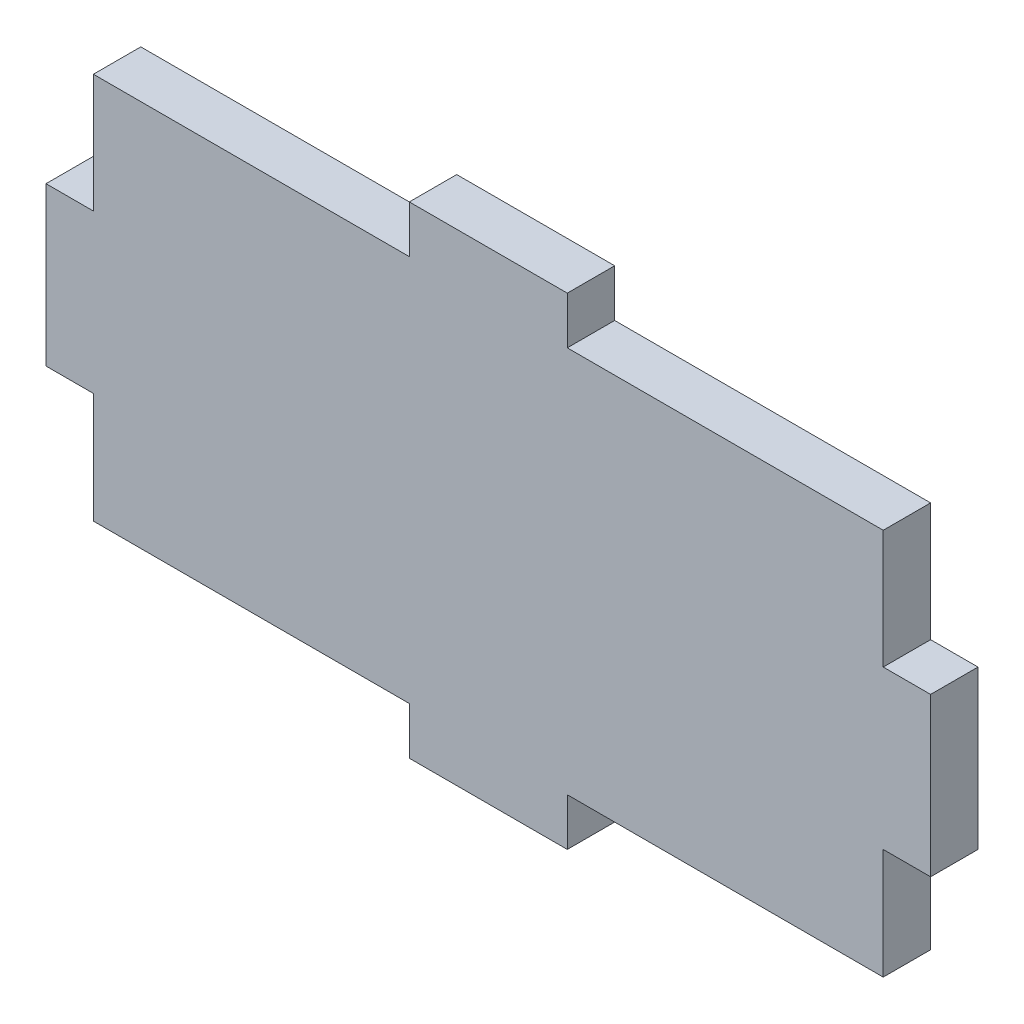
ISO-10303-21;
HEADER;
FILE_DESCRIPTION(('STEP AP214'),'2;1');
FILE_NAME('part.step','',(''),(''),'','','');
FILE_SCHEMA(('AUTOMOTIVE_DESIGN { 1 0 10303 214 1 1 1 1 }'));
ENDSEC;
DATA;
#1=APPLICATION_CONTEXT('core data for automotive mechanical design processes');
#2=APPLICATION_PROTOCOL_DEFINITION('international standard','automotive_design',2000,#1);
#3=PRODUCT_CONTEXT('',#1,'mechanical');
#4=PRODUCT('Part','Part','',(#3));
#5=PRODUCT_RELATED_PRODUCT_CATEGORY('part','',(#4));
#6=PRODUCT_DEFINITION_FORMATION('','',#4);
#7=PRODUCT_DEFINITION_CONTEXT('part definition',#1,'design');
#8=PRODUCT_DEFINITION('design','',#6,#7);
#9=PRODUCT_DEFINITION_SHAPE('','',#8);
#10=(LENGTH_UNIT() NAMED_UNIT(*) SI_UNIT(.MILLI.,.METRE.));
#11=(NAMED_UNIT(*) PLANE_ANGLE_UNIT() SI_UNIT($,.RADIAN.));
#12=(NAMED_UNIT(*) SI_UNIT($,.STERADIAN.) SOLID_ANGLE_UNIT());
#13=UNCERTAINTY_MEASURE_WITH_UNIT(LENGTH_MEASURE(1.E-05),#10,'distance_accuracy_value','');
#14=(GEOMETRIC_REPRESENTATION_CONTEXT(3) GLOBAL_UNCERTAINTY_ASSIGNED_CONTEXT((#13)) GLOBAL_UNIT_ASSIGNED_CONTEXT((#10,
#11,#12)) REPRESENTATION_CONTEXT('',''));
#15=CARTESIAN_POINT('',(0.,0.,0.));
#16=DIRECTION('',(0.,0.,1.));
#17=DIRECTION('',(1.,0.,0.));
#18=AXIS2_PLACEMENT_3D('',#15,#16,#17);
#19=CARTESIAN_POINT('',(3.47631815242721,8.33761556371931,3.));
#20=DIRECTION('',(0.,1.,0.));
#21=DIRECTION('',(-1.,0.,0.));
#22=AXIS2_PLACEMENT_3D('',#19,#20,#21);
#23=PLANE('',#22);
#24=DIRECTION('',(1.,0.,0.));
#25=VECTOR('',#24,1.);
#26=CARTESIAN_POINT('',(3.47631815242721,8.33761556371931,0.));
#27=LINE('',#26,#25);
#28=CARTESIAN_POINT('',(3.47631815242721,8.33761556371931,0.));
#29=VERTEX_POINT('',#28);
#30=CARTESIAN_POINT('',(23.4763181524272,8.33761556371931,0.));
#31=VERTEX_POINT('',#30);
#32=EDGE_CURVE('E205',#29,#31,#27,.T.);
#33=ORIENTED_EDGE('',*,*,#32,.T.);
#34=DIRECTION('',(0.,0.,-1.));
#35=VECTOR('',#34,1.);
#36=CARTESIAN_POINT('',(23.4763181524272,8.33761556371931,3.));
#37=LINE('',#36,#35);
#38=CARTESIAN_POINT('',(23.4763181524272,8.33761556371931,3.));
#39=VERTEX_POINT('',#38);
#40=EDGE_CURVE('E11',#39,#31,#37,.T.);
#41=ORIENTED_EDGE('',*,*,#40,.F.);
#42=DIRECTION('',(1.,0.,0.));
#43=VECTOR('',#42,1.);
#44=CARTESIAN_POINT('',(3.47631815242721,8.33761556371931,3.));
#45=LINE('',#44,#43);
#46=CARTESIAN_POINT('',(3.47631815242721,8.33761556371931,3.));
#47=VERTEX_POINT('',#46);
#48=EDGE_CURVE('E243',#47,#39,#45,.T.);
#49=ORIENTED_EDGE('',*,*,#48,.F.);
#50=DIRECTION('',(0.,0.,-1.));
#51=VECTOR('',#50,1.);
#52=CARTESIAN_POINT('',(3.47631815242721,8.33761556371931,3.));
#53=LINE('',#52,#51);
#54=EDGE_CURVE('E201',#47,#29,#53,.T.);
#55=ORIENTED_EDGE('',*,*,#54,.T.);
#56=EDGE_LOOP('',(#33,#41,#49,#55));
#57=FACE_BOUND('',#56,.T.);
#58=ADVANCED_FACE('F37',(#57),#23,.F.);
#59=CARTESIAN_POINT('',(23.4763181524272,8.33761556371931,3.));
#60=DIRECTION('',(-1.,0.,0.));
#61=DIRECTION('',(0.,-1.,0.));
#62=AXIS2_PLACEMENT_3D('',#59,#60,#61);
#63=PLANE('',#62);
#64=DIRECTION('',(0.,1.,0.));
#65=VECTOR('',#64,1.);
#66=CARTESIAN_POINT('',(23.4763181524272,8.33761556371931,0.));
#67=LINE('',#66,#65);
#68=CARTESIAN_POINT('',(23.4763181524272,15.3376155637193,0.));
#69=VERTEX_POINT('',#68);
#70=EDGE_CURVE('E208',#31,#69,#67,.T.);
#71=ORIENTED_EDGE('',*,*,#70,.T.);
#72=DIRECTION('',(0.,0.,-1.));
#73=VECTOR('',#72,1.);
#74=CARTESIAN_POINT('',(23.4763181524272,15.3376155637193,3.));
#75=LINE('',#74,#73);
#76=CARTESIAN_POINT('',(23.4763181524272,15.3376155637193,3.));
#77=VERTEX_POINT('',#76);
#78=EDGE_CURVE('E45',#77,#69,#75,.T.);
#79=ORIENTED_EDGE('',*,*,#78,.F.);
#80=DIRECTION('',(0.,1.,0.));
#81=VECTOR('',#80,1.);
#82=CARTESIAN_POINT('',(23.4763181524272,8.33761556371931,3.));
#83=LINE('',#82,#81);
#84=EDGE_CURVE('E132',#39,#77,#83,.T.);
#85=ORIENTED_EDGE('',*,*,#84,.F.);
#86=ORIENTED_EDGE('',*,*,#40,.T.);
#87=EDGE_LOOP('',(#71,#79,#85,#86));
#88=FACE_BOUND('',#87,.T.);
#89=ADVANCED_FACE('F361',(#88),#63,.F.);
#90=CARTESIAN_POINT('',(23.4763181524272,15.3376155637193,3.));
#91=DIRECTION('',(0.,1.,0.));
#92=DIRECTION('',(-1.,0.,0.));
#93=AXIS2_PLACEMENT_3D('',#90,#91,#92);
#94=PLANE('',#93);
#95=DIRECTION('',(1.,0.,0.));
#96=VECTOR('',#95,1.);
#97=CARTESIAN_POINT('',(23.4763181524272,15.3376155637193,0.));
#98=LINE('',#97,#96);
#99=CARTESIAN_POINT('',(26.4763181524272,15.3376155637193,0.));
#100=VERTEX_POINT('',#99);
#101=EDGE_CURVE('E210',#69,#100,#98,.T.);
#102=ORIENTED_EDGE('',*,*,#101,.T.);
#103=DIRECTION('',(0.,0.,-1.));
#104=VECTOR('',#103,1.);
#105=CARTESIAN_POINT('',(26.4763181524272,15.3376155637193,3.));
#106=LINE('',#105,#104);
#107=CARTESIAN_POINT('',(26.4763181524272,15.3376155637193,3.));
#108=VERTEX_POINT('',#107);
#109=EDGE_CURVE('E286',#108,#100,#106,.T.);
#110=ORIENTED_EDGE('',*,*,#109,.F.);
#111=DIRECTION('',(1.,0.,0.));
#112=VECTOR('',#111,1.);
#113=CARTESIAN_POINT('',(23.4763181524272,15.3376155637193,3.));
#114=LINE('',#113,#112);
#115=EDGE_CURVE('E294',#77,#108,#114,.T.);
#116=ORIENTED_EDGE('',*,*,#115,.F.);
#117=ORIENTED_EDGE('',*,*,#78,.T.);
#118=EDGE_LOOP('',(#102,#110,#116,#117));
#119=FACE_BOUND('',#118,.T.);
#120=ADVANCED_FACE('F292',(#119),#94,.F.);
#121=CARTESIAN_POINT('',(26.4763181524272,15.3376155637193,3.));
#122=DIRECTION('',(-1.,0.,0.));
#123=DIRECTION('',(0.,0.,1.));
#124=AXIS2_PLACEMENT_3D('',#121,#122,#123);
#125=PLANE('',#124);
#126=DIRECTION('',(0.,1.,0.));
#127=VECTOR('',#126,1.);
#128=CARTESIAN_POINT('',(26.4763181524272,15.3376155637193,0.));
#129=LINE('',#128,#127);
#130=CARTESIAN_POINT('',(26.4763181524272,25.3376155637193,0.));
#131=VERTEX_POINT('',#130);
#132=EDGE_CURVE('E212',#100,#131,#129,.T.);
#133=ORIENTED_EDGE('',*,*,#132,.T.);
#134=DIRECTION('',(0.,0.,-1.));
#135=VECTOR('',#134,1.);
#136=CARTESIAN_POINT('',(26.4763181524272,25.3376155637193,3.));
#137=LINE('',#136,#135);
#138=CARTESIAN_POINT('',(26.4763181524272,25.3376155637193,3.));
#139=VERTEX_POINT('',#138);
#140=EDGE_CURVE('E283',#139,#131,#137,.T.);
#141=ORIENTED_EDGE('',*,*,#140,.F.);
#142=DIRECTION('',(0.,1.,0.));
#143=VECTOR('',#142,1.);
#144=CARTESIAN_POINT('',(26.4763181524272,15.3376155637193,3.));
#145=LINE('',#144,#143);
#146=EDGE_CURVE('E312',#108,#139,#145,.T.);
#147=ORIENTED_EDGE('',*,*,#146,.F.);
#148=ORIENTED_EDGE('',*,*,#109,.T.);
#149=EDGE_LOOP('',(#133,#141,#147,#148));
#150=FACE_BOUND('',#149,.T.);
#151=ADVANCED_FACE('F303',(#150),#125,.F.);
#152=CARTESIAN_POINT('',(26.4763181524272,25.3376155637193,3.));
#153=DIRECTION('',(0.,-1.,0.));
#154=DIRECTION('',(0.,0.,-1.));
#155=AXIS2_PLACEMENT_3D('',#152,#153,#154);
#156=PLANE('',#155);
#157=DIRECTION('',(-1.,0.,0.));
#158=VECTOR('',#157,1.);
#159=CARTESIAN_POINT('',(26.4763181524272,25.3376155637193,0.));
#160=LINE('',#159,#158);
#161=CARTESIAN_POINT('',(23.4763181524272,25.3376155637193,0.));
#162=VERTEX_POINT('',#161);
#163=EDGE_CURVE('E214',#131,#162,#160,.T.);
#164=ORIENTED_EDGE('',*,*,#163,.T.);
#165=DIRECTION('',(0.,0.,-1.));
#166=VECTOR('',#165,1.);
#167=CARTESIAN_POINT('',(23.4763181524272,25.3376155637193,3.));
#168=LINE('',#167,#166);
#169=CARTESIAN_POINT('',(23.4763181524272,25.3376155637193,3.));
#170=VERTEX_POINT('',#169);
#171=EDGE_CURVE('E280',#170,#162,#168,.T.);
#172=ORIENTED_EDGE('',*,*,#171,.F.);
#173=DIRECTION('',(-1.,0.,0.));
#174=VECTOR('',#173,1.);
#175=CARTESIAN_POINT('',(26.4763181524272,25.3376155637193,3.));
#176=LINE('',#175,#174);
#177=EDGE_CURVE('E309',#139,#170,#176,.T.);
#178=ORIENTED_EDGE('',*,*,#177,.F.);
#179=ORIENTED_EDGE('',*,*,#140,.T.);
#180=EDGE_LOOP('',(#164,#172,#178,#179));
#181=FACE_BOUND('',#180,.T.);
#182=ADVANCED_FACE('F307',(#181),#156,.F.);
#183=CARTESIAN_POINT('',(23.4763181524272,25.3376155637193,3.));
#184=DIRECTION('',(-1.,0.,0.));
#185=DIRECTION('',(0.,-1.,0.));
#186=AXIS2_PLACEMENT_3D('',#183,#184,#185);
#187=PLANE('',#186);
#188=DIRECTION('',(0.,1.,0.));
#189=VECTOR('',#188,1.);
#190=CARTESIAN_POINT('',(23.4763181524272,25.3376155637193,0.));
#191=LINE('',#190,#189);
#192=CARTESIAN_POINT('',(23.4763181524272,32.8376155637193,0.));
#193=VERTEX_POINT('',#192);
#194=EDGE_CURVE('E216',#162,#193,#191,.T.);
#195=ORIENTED_EDGE('',*,*,#194,.T.);
#196=DIRECTION('',(0.,0.,-1.));
#197=VECTOR('',#196,1.);
#198=CARTESIAN_POINT('',(23.4763181524272,32.8376155637193,3.));
#199=LINE('',#198,#197);
#200=CARTESIAN_POINT('',(23.4763181524272,32.8376155637193,3.));
#201=VERTEX_POINT('',#200);
#202=EDGE_CURVE('E277',#201,#193,#199,.T.);
#203=ORIENTED_EDGE('',*,*,#202,.F.);
#204=DIRECTION('',(0.,1.,0.));
#205=VECTOR('',#204,1.);
#206=CARTESIAN_POINT('',(23.4763181524272,25.3376155637193,3.));
#207=LINE('',#206,#205);
#208=EDGE_CURVE('E311',#170,#201,#207,.T.);
#209=ORIENTED_EDGE('',*,*,#208,.F.);
#210=ORIENTED_EDGE('',*,*,#171,.T.);
#211=EDGE_LOOP('',(#195,#203,#209,#210));
#212=FACE_BOUND('',#211,.T.);
#213=ADVANCED_FACE('F374',(#212),#187,.F.);
#214=CARTESIAN_POINT('',(3.4763181524272,32.8376155637193,3.));
#215=DIRECTION('',(0.,-1.,0.));
#216=DIRECTION('',(1.,0.,0.));
#217=AXIS2_PLACEMENT_3D('',#214,#215,#216);
#218=PLANE('',#217);
#219=DIRECTION('',(-1.,0.,0.));
#220=VECTOR('',#219,1.);
#221=CARTESIAN_POINT('',(3.4763181524272,32.8376155637193,0.));
#222=LINE('',#221,#220);
#223=CARTESIAN_POINT('',(3.4763181524272,32.8376155637193,0.));
#224=VERTEX_POINT('',#223);
#225=EDGE_CURVE('E218',#193,#224,#222,.T.);
#226=ORIENTED_EDGE('',*,*,#225,.T.);
#227=DIRECTION('',(0.,0.,-1.));
#228=VECTOR('',#227,1.);
#229=CARTESIAN_POINT('',(3.4763181524272,32.8376155637193,3.));
#230=LINE('',#229,#228);
#231=CARTESIAN_POINT('',(3.4763181524272,32.8376155637193,3.));
#232=VERTEX_POINT('',#231);
#233=EDGE_CURVE('E274',#232,#224,#230,.T.);
#234=ORIENTED_EDGE('',*,*,#233,.F.);
#235=DIRECTION('',(-1.,0.,0.));
#236=VECTOR('',#235,1.);
#237=CARTESIAN_POINT('',(3.4763181524272,32.8376155637193,3.));
#238=LINE('',#237,#236);
#239=EDGE_CURVE('E314',#201,#232,#238,.T.);
#240=ORIENTED_EDGE('',*,*,#239,.F.);
#241=ORIENTED_EDGE('',*,*,#202,.T.);
#242=EDGE_LOOP('',(#226,#234,#240,#241));
#243=FACE_BOUND('',#242,.T.);
#244=ADVANCED_FACE('F377',(#243),#218,.F.);
#245=CARTESIAN_POINT('',(3.4763181524272,32.8376155637193,3.));
#246=DIRECTION('',(-1.,0.,0.));
#247=DIRECTION('',(0.,-1.,0.));
#248=AXIS2_PLACEMENT_3D('',#245,#246,#247);
#249=PLANE('',#248);
#250=DIRECTION('',(0.,1.,0.));
#251=VECTOR('',#250,1.);
#252=CARTESIAN_POINT('',(3.4763181524272,32.8376155637193,0.));
#253=LINE('',#252,#251);
#254=CARTESIAN_POINT('',(3.47631815242721,35.8376155637193,0.));
#255=VERTEX_POINT('',#254);
#256=EDGE_CURVE('E220',#224,#255,#253,.T.);
#257=ORIENTED_EDGE('',*,*,#256,.T.);
#258=DIRECTION('',(0.,0.,-1.));
#259=VECTOR('',#258,1.);
#260=CARTESIAN_POINT('',(3.47631815242721,35.8376155637193,3.));
#261=LINE('',#260,#259);
#262=CARTESIAN_POINT('',(3.47631815242721,35.8376155637193,3.));
#263=VERTEX_POINT('',#262);
#264=EDGE_CURVE('E271',#263,#255,#261,.T.);
#265=ORIENTED_EDGE('',*,*,#264,.F.);
#266=DIRECTION('',(0.,1.,0.));
#267=VECTOR('',#266,1.);
#268=CARTESIAN_POINT('',(3.4763181524272,32.8376155637193,3.));
#269=LINE('',#268,#267);
#270=EDGE_CURVE('E320',#232,#263,#269,.T.);
#271=ORIENTED_EDGE('',*,*,#270,.F.);
#272=ORIENTED_EDGE('',*,*,#233,.T.);
#273=EDGE_LOOP('',(#257,#265,#271,#272));
#274=FACE_BOUND('',#273,.T.);
#275=ADVANCED_FACE('F381',(#274),#249,.F.);
#276=CARTESIAN_POINT('',(3.47631815242721,35.8376155637193,3.));
#277=DIRECTION('',(0.,-1.,0.));
#278=DIRECTION('',(0.,0.,-1.));
#279=AXIS2_PLACEMENT_3D('',#276,#277,#278);
#280=PLANE('',#279);
#281=DIRECTION('',(-1.,0.,0.));
#282=VECTOR('',#281,1.);
#283=CARTESIAN_POINT('',(3.47631815242721,35.8376155637193,0.));
#284=LINE('',#283,#282);
#285=CARTESIAN_POINT('',(-6.52368184757279,35.8376155637193,0.));
#286=VERTEX_POINT('',#285);
#287=EDGE_CURVE('E222',#255,#286,#284,.T.);
#288=ORIENTED_EDGE('',*,*,#287,.T.);
#289=DIRECTION('',(0.,0.,-1.));
#290=VECTOR('',#289,1.);
#291=CARTESIAN_POINT('',(-6.52368184757279,35.8376155637193,3.));
#292=LINE('',#291,#290);
#293=CARTESIAN_POINT('',(-6.52368184757279,35.8376155637193,3.));
#294=VERTEX_POINT('',#293);
#295=EDGE_CURVE('E268',#294,#286,#292,.T.);
#296=ORIENTED_EDGE('',*,*,#295,.F.);
#297=DIRECTION('',(-1.,0.,0.));
#298=VECTOR('',#297,1.);
#299=CARTESIAN_POINT('',(3.47631815242721,35.8376155637193,3.));
#300=LINE('',#299,#298);
#301=EDGE_CURVE('E322',#263,#294,#300,.T.);
#302=ORIENTED_EDGE('',*,*,#301,.F.);
#303=ORIENTED_EDGE('',*,*,#264,.T.);
#304=EDGE_LOOP('',(#288,#296,#302,#303));
#305=FACE_BOUND('',#304,.T.);
#306=ADVANCED_FACE('F385',(#305),#280,.F.);
#307=CARTESIAN_POINT('',(-6.52368184757279,35.8376155637193,3.));
#308=DIRECTION('',(1.,0.,0.));
#309=DIRECTION('',(0.,1.,0.));
#310=AXIS2_PLACEMENT_3D('',#307,#308,#309);
#311=PLANE('',#310);
#312=DIRECTION('',(0.,-1.,0.));
#313=VECTOR('',#312,1.);
#314=CARTESIAN_POINT('',(-6.52368184757279,35.8376155637193,0.));
#315=LINE('',#314,#313);
#316=CARTESIAN_POINT('',(-6.52368184757279,32.8376155637193,0.));
#317=VERTEX_POINT('',#316);
#318=EDGE_CURVE('E224',#286,#317,#315,.T.);
#319=ORIENTED_EDGE('',*,*,#318,.T.);
#320=DIRECTION('',(0.,0.,-1.));
#321=VECTOR('',#320,1.);
#322=CARTESIAN_POINT('',(-6.52368184757279,32.8376155637193,3.));
#323=LINE('',#322,#321);
#324=CARTESIAN_POINT('',(-6.52368184757279,32.8376155637193,3.));
#325=VERTEX_POINT('',#324);
#326=EDGE_CURVE('E265',#325,#317,#323,.T.);
#327=ORIENTED_EDGE('',*,*,#326,.F.);
#328=DIRECTION('',(0.,-1.,0.));
#329=VECTOR('',#328,1.);
#330=CARTESIAN_POINT('',(-6.52368184757279,35.8376155637193,3.));
#331=LINE('',#330,#329);
#332=EDGE_CURVE('E324',#294,#325,#331,.T.);
#333=ORIENTED_EDGE('',*,*,#332,.F.);
#334=ORIENTED_EDGE('',*,*,#295,.T.);
#335=EDGE_LOOP('',(#319,#327,#333,#334));
#336=FACE_BOUND('',#335,.T.);
#337=ADVANCED_FACE('F389',(#336),#311,.F.);
#338=CARTESIAN_POINT('',(-6.52368184757279,32.8376155637193,3.));
#339=DIRECTION('',(0.,-1.,0.));
#340=DIRECTION('',(1.,0.,0.));
#341=AXIS2_PLACEMENT_3D('',#338,#339,#340);
#342=PLANE('',#341);
#343=DIRECTION('',(-1.,0.,0.));
#344=VECTOR('',#343,1.);
#345=CARTESIAN_POINT('',(-6.52368184757279,32.8376155637193,0.));
#346=LINE('',#345,#344);
#347=CARTESIAN_POINT('',(-26.5236818475728,32.8376155637193,0.));
#348=VERTEX_POINT('',#347);
#349=EDGE_CURVE('E226',#317,#348,#346,.T.);
#350=ORIENTED_EDGE('',*,*,#349,.T.);
#351=DIRECTION('',(0.,0.,-1.));
#352=VECTOR('',#351,1.);
#353=CARTESIAN_POINT('',(-26.5236818475728,32.8376155637193,3.));
#354=LINE('',#353,#352);
#355=CARTESIAN_POINT('',(-26.5236818475728,32.8376155637193,3.));
#356=VERTEX_POINT('',#355);
#357=EDGE_CURVE('E262',#356,#348,#354,.T.);
#358=ORIENTED_EDGE('',*,*,#357,.F.);
#359=DIRECTION('',(-1.,0.,0.));
#360=VECTOR('',#359,1.);
#361=CARTESIAN_POINT('',(-6.52368184757279,32.8376155637193,3.));
#362=LINE('',#361,#360);
#363=EDGE_CURVE('E326',#325,#356,#362,.T.);
#364=ORIENTED_EDGE('',*,*,#363,.F.);
#365=ORIENTED_EDGE('',*,*,#326,.T.);
#366=EDGE_LOOP('',(#350,#358,#364,#365));
#367=FACE_BOUND('',#366,.T.);
#368=ADVANCED_FACE('F393',(#367),#342,.F.);
#369=CARTESIAN_POINT('',(-26.5236818475728,25.3376155637193,3.));
#370=DIRECTION('',(1.,0.,0.));
#371=DIRECTION('',(0.,1.,0.));
#372=AXIS2_PLACEMENT_3D('',#369,#370,#371);
#373=PLANE('',#372);
#374=DIRECTION('',(0.,-1.,0.));
#375=VECTOR('',#374,1.);
#376=CARTESIAN_POINT('',(-26.5236818475728,25.3376155637193,0.));
#377=LINE('',#376,#375);
#378=CARTESIAN_POINT('',(-26.5236818475728,25.3376155637193,0.));
#379=VERTEX_POINT('',#378);
#380=EDGE_CURVE('E228',#348,#379,#377,.T.);
#381=ORIENTED_EDGE('',*,*,#380,.T.);
#382=DIRECTION('',(0.,0.,-1.));
#383=VECTOR('',#382,1.);
#384=CARTESIAN_POINT('',(-26.5236818475728,25.3376155637193,3.));
#385=LINE('',#384,#383);
#386=CARTESIAN_POINT('',(-26.5236818475728,25.3376155637193,3.));
#387=VERTEX_POINT('',#386);
#388=EDGE_CURVE('E259',#387,#379,#385,.T.);
#389=ORIENTED_EDGE('',*,*,#388,.F.);
#390=DIRECTION('',(0.,-1.,0.));
#391=VECTOR('',#390,1.);
#392=CARTESIAN_POINT('',(-26.5236818475728,25.3376155637193,3.));
#393=LINE('',#392,#391);
#394=EDGE_CURVE('E328',#356,#387,#393,.T.);
#395=ORIENTED_EDGE('',*,*,#394,.F.);
#396=ORIENTED_EDGE('',*,*,#357,.T.);
#397=EDGE_LOOP('',(#381,#389,#395,#396));
#398=FACE_BOUND('',#397,.T.);
#399=ADVANCED_FACE('F397',(#398),#373,.F.);
#400=CARTESIAN_POINT('',(-29.5236818475728,25.3376155637193,3.));
#401=DIRECTION('',(0.,-1.,0.));
#402=DIRECTION('',(0.,0.,-1.));
#403=AXIS2_PLACEMENT_3D('',#400,#401,#402);
#404=PLANE('',#403);
#405=DIRECTION('',(-1.,0.,0.));
#406=VECTOR('',#405,1.);
#407=CARTESIAN_POINT('',(-29.5236818475728,25.3376155637193,0.));
#408=LINE('',#407,#406);
#409=CARTESIAN_POINT('',(-29.5236818475728,25.3376155637193,0.));
#410=VERTEX_POINT('',#409);
#411=EDGE_CURVE('E230',#379,#410,#408,.T.);
#412=ORIENTED_EDGE('',*,*,#411,.T.);
#413=DIRECTION('',(0.,0.,-1.));
#414=VECTOR('',#413,1.);
#415=CARTESIAN_POINT('',(-29.5236818475728,25.3376155637193,3.));
#416=LINE('',#415,#414);
#417=CARTESIAN_POINT('',(-29.5236818475728,25.3376155637193,3.));
#418=VERTEX_POINT('',#417);
#419=EDGE_CURVE('E256',#418,#410,#416,.T.);
#420=ORIENTED_EDGE('',*,*,#419,.F.);
#421=DIRECTION('',(-1.,0.,0.));
#422=VECTOR('',#421,1.);
#423=CARTESIAN_POINT('',(-29.5236818475728,25.3376155637193,3.));
#424=LINE('',#423,#422);
#425=EDGE_CURVE('E330',#387,#418,#424,.T.);
#426=ORIENTED_EDGE('',*,*,#425,.F.);
#427=ORIENTED_EDGE('',*,*,#388,.T.);
#428=EDGE_LOOP('',(#412,#420,#426,#427));
#429=FACE_BOUND('',#428,.T.);
#430=ADVANCED_FACE('F401',(#429),#404,.F.);
#431=CARTESIAN_POINT('',(-29.5236818475728,15.3376155637193,3.));
#432=DIRECTION('',(1.,0.,0.));
#433=DIRECTION('',(0.,0.,-1.));
#434=AXIS2_PLACEMENT_3D('',#431,#432,#433);
#435=PLANE('',#434);
#436=DIRECTION('',(0.,-1.,0.));
#437=VECTOR('',#436,1.);
#438=CARTESIAN_POINT('',(-29.5236818475728,15.3376155637193,0.));
#439=LINE('',#438,#437);
#440=CARTESIAN_POINT('',(-29.5236818475728,15.3376155637193,0.));
#441=VERTEX_POINT('',#440);
#442=EDGE_CURVE('E232',#410,#441,#439,.T.);
#443=ORIENTED_EDGE('',*,*,#442,.T.);
#444=DIRECTION('',(0.,0.,-1.));
#445=VECTOR('',#444,1.);
#446=CARTESIAN_POINT('',(-29.5236818475728,15.3376155637193,3.));
#447=LINE('',#446,#445);
#448=CARTESIAN_POINT('',(-29.5236818475728,15.3376155637193,3.));
#449=VERTEX_POINT('',#448);
#450=EDGE_CURVE('E253',#449,#441,#447,.T.);
#451=ORIENTED_EDGE('',*,*,#450,.F.);
#452=DIRECTION('',(0.,-1.,0.));
#453=VECTOR('',#452,1.);
#454=CARTESIAN_POINT('',(-29.5236818475728,15.3376155637193,3.));
#455=LINE('',#454,#453);
#456=EDGE_CURVE('E332',#418,#449,#455,.T.);
#457=ORIENTED_EDGE('',*,*,#456,.F.);
#458=ORIENTED_EDGE('',*,*,#419,.T.);
#459=EDGE_LOOP('',(#443,#451,#457,#458));
#460=FACE_BOUND('',#459,.T.);
#461=ADVANCED_FACE('F405',(#460),#435,.F.);
#462=CARTESIAN_POINT('',(-26.5236818475728,15.3376155637193,3.));
#463=DIRECTION('',(0.,1.,0.));
#464=DIRECTION('',(0.,0.,1.));
#465=AXIS2_PLACEMENT_3D('',#462,#463,#464);
#466=PLANE('',#465);
#467=DIRECTION('',(1.,0.,0.));
#468=VECTOR('',#467,1.);
#469=CARTESIAN_POINT('',(-26.5236818475728,15.3376155637193,0.));
#470=LINE('',#469,#468);
#471=CARTESIAN_POINT('',(-26.5236818475728,15.3376155637193,0.));
#472=VERTEX_POINT('',#471);
#473=EDGE_CURVE('E234',#441,#472,#470,.T.);
#474=ORIENTED_EDGE('',*,*,#473,.T.);
#475=DIRECTION('',(0.,0.,-1.));
#476=VECTOR('',#475,1.);
#477=CARTESIAN_POINT('',(-26.5236818475728,15.3376155637193,3.));
#478=LINE('',#477,#476);
#479=CARTESIAN_POINT('',(-26.5236818475728,15.3376155637193,3.));
#480=VERTEX_POINT('',#479);
#481=EDGE_CURVE('E250',#480,#472,#478,.T.);
#482=ORIENTED_EDGE('',*,*,#481,.F.);
#483=DIRECTION('',(1.,0.,0.));
#484=VECTOR('',#483,1.);
#485=CARTESIAN_POINT('',(-26.5236818475728,15.3376155637193,3.));
#486=LINE('',#485,#484);
#487=EDGE_CURVE('E334',#449,#480,#486,.T.);
#488=ORIENTED_EDGE('',*,*,#487,.F.);
#489=ORIENTED_EDGE('',*,*,#450,.T.);
#490=EDGE_LOOP('',(#474,#482,#488,#489));
#491=FACE_BOUND('',#490,.T.);
#492=ADVANCED_FACE('F409',(#491),#466,.F.);
#493=CARTESIAN_POINT('',(-26.5236818475728,8.3376155637193,3.));
#494=DIRECTION('',(1.,0.,0.));
#495=DIRECTION('',(0.,1.,0.));
#496=AXIS2_PLACEMENT_3D('',#493,#494,#495);
#497=PLANE('',#496);
#498=DIRECTION('',(0.,-1.,0.));
#499=VECTOR('',#498,1.);
#500=CARTESIAN_POINT('',(-26.5236818475728,8.3376155637193,0.));
#501=LINE('',#500,#499);
#502=CARTESIAN_POINT('',(-26.5236818475728,8.3376155637193,0.));
#503=VERTEX_POINT('',#502);
#504=EDGE_CURVE('E236',#472,#503,#501,.T.);
#505=ORIENTED_EDGE('',*,*,#504,.T.);
#506=DIRECTION('',(0.,0.,-1.));
#507=VECTOR('',#506,1.);
#508=CARTESIAN_POINT('',(-26.5236818475728,8.3376155637193,3.));
#509=LINE('',#508,#507);
#510=CARTESIAN_POINT('',(-26.5236818475728,8.3376155637193,3.));
#511=VERTEX_POINT('',#510);
#512=EDGE_CURVE('E247',#511,#503,#509,.T.);
#513=ORIENTED_EDGE('',*,*,#512,.F.);
#514=DIRECTION('',(0.,-1.,0.));
#515=VECTOR('',#514,1.);
#516=CARTESIAN_POINT('',(-26.5236818475728,8.3376155637193,3.));
#517=LINE('',#516,#515);
#518=EDGE_CURVE('E336',#480,#511,#517,.T.);
#519=ORIENTED_EDGE('',*,*,#518,.F.);
#520=ORIENTED_EDGE('',*,*,#481,.T.);
#521=EDGE_LOOP('',(#505,#513,#519,#520));
#522=FACE_BOUND('',#521,.T.);
#523=ADVANCED_FACE('F342',(#522),#497,.F.);
#524=CARTESIAN_POINT('',(-6.52368184757279,8.33761556371931,3.));
#525=DIRECTION('',(0.,1.,0.));
#526=DIRECTION('',(-1.,0.,0.));
#527=AXIS2_PLACEMENT_3D('',#524,#525,#526);
#528=PLANE('',#527);
#529=DIRECTION('',(1.,0.,0.));
#530=VECTOR('',#529,1.);
#531=CARTESIAN_POINT('',(-6.52368184757279,8.33761556371931,0.));
#532=LINE('',#531,#530);
#533=CARTESIAN_POINT('',(-6.52368184757279,8.33761556371931,0.));
#534=VERTEX_POINT('',#533);
#535=EDGE_CURVE('E238',#503,#534,#532,.T.);
#536=ORIENTED_EDGE('',*,*,#535,.T.);
#537=DIRECTION('',(0.,0.,-1.));
#538=VECTOR('',#537,1.);
#539=CARTESIAN_POINT('',(-6.52368184757279,8.33761556371931,3.));
#540=LINE('',#539,#538);
#541=CARTESIAN_POINT('',(-6.52368184757279,8.33761556371931,3.));
#542=VERTEX_POINT('',#541);
#543=EDGE_CURVE('E196',#542,#534,#540,.T.);
#544=ORIENTED_EDGE('',*,*,#543,.F.);
#545=DIRECTION('',(1.,0.,0.));
#546=VECTOR('',#545,1.);
#547=CARTESIAN_POINT('',(-6.52368184757279,8.33761556371931,3.));
#548=LINE('',#547,#546);
#549=EDGE_CURVE('E187',#511,#542,#548,.T.);
#550=ORIENTED_EDGE('',*,*,#549,.F.);
#551=ORIENTED_EDGE('',*,*,#512,.T.);
#552=EDGE_LOOP('',(#536,#544,#550,#551));
#553=FACE_BOUND('',#552,.T.);
#554=ADVANCED_FACE('F346',(#553),#528,.F.);
#555=CARTESIAN_POINT('',(-6.52368184757279,5.33761556371931,3.));
#556=DIRECTION('',(1.,0.,0.));
#557=DIRECTION('',(0.,0.,-1.));
#558=AXIS2_PLACEMENT_3D('',#555,#556,#557);
#559=PLANE('',#558);
#560=DIRECTION('',(0.,-1.,0.));
#561=VECTOR('',#560,1.);
#562=CARTESIAN_POINT('',(-6.52368184757279,5.33761556371931,0.));
#563=LINE('',#562,#561);
#564=CARTESIAN_POINT('',(-6.52368184757279,5.33761556371931,0.));
#565=VERTEX_POINT('',#564);
#566=EDGE_CURVE('E195',#534,#565,#563,.T.);
#567=ORIENTED_EDGE('',*,*,#566,.T.);
#568=DIRECTION('',(0.,0.,-1.));
#569=VECTOR('',#568,1.);
#570=CARTESIAN_POINT('',(-6.52368184757279,5.33761556371931,3.));
#571=LINE('',#570,#569);
#572=CARTESIAN_POINT('',(-6.52368184757279,5.33761556371931,3.));
#573=VERTEX_POINT('',#572);
#574=EDGE_CURVE('E192',#573,#565,#571,.T.);
#575=ORIENTED_EDGE('',*,*,#574,.F.);
#576=DIRECTION('',(0.,-1.,0.));
#577=VECTOR('',#576,1.);
#578=CARTESIAN_POINT('',(-6.52368184757279,5.33761556371931,3.));
#579=LINE('',#578,#577);
#580=EDGE_CURVE('E181',#542,#573,#579,.T.);
#581=ORIENTED_EDGE('',*,*,#580,.F.);
#582=ORIENTED_EDGE('',*,*,#543,.T.);
#583=EDGE_LOOP('',(#567,#575,#581,#582));
#584=FACE_BOUND('',#583,.T.);
#585=ADVANCED_FACE('F193',(#584),#559,.F.);
#586=CARTESIAN_POINT('',(3.47631815242721,5.33761556371931,3.));
#587=DIRECTION('',(0.,1.,0.));
#588=DIRECTION('',(-1.,0.,0.));
#589=AXIS2_PLACEMENT_3D('',#586,#587,#588);
#590=PLANE('',#589);
#591=DIRECTION('',(1.,0.,0.));
#592=VECTOR('',#591,1.);
#593=CARTESIAN_POINT('',(3.47631815242721,5.33761556371931,0.));
#594=LINE('',#593,#592);
#595=CARTESIAN_POINT('',(3.47631815242721,5.33761556371931,0.));
#596=VERTEX_POINT('',#595);
#597=EDGE_CURVE('E118',#565,#596,#594,.T.);
#598=ORIENTED_EDGE('',*,*,#597,.T.);
#599=DIRECTION('',(0.,0.,-1.));
#600=VECTOR('',#599,1.);
#601=CARTESIAN_POINT('',(3.47631815242721,5.33761556371931,3.));
#602=LINE('',#601,#600);
#603=CARTESIAN_POINT('',(3.47631815242721,5.33761556371931,3.));
#604=VERTEX_POINT('',#603);
#605=EDGE_CURVE('E197',#604,#596,#602,.T.);
#606=ORIENTED_EDGE('',*,*,#605,.F.);
#607=DIRECTION('',(1.,0.,0.));
#608=VECTOR('',#607,1.);
#609=CARTESIAN_POINT('',(3.47631815242721,5.33761556371931,3.));
#610=LINE('',#609,#608);
#611=EDGE_CURVE('E185',#573,#604,#610,.T.);
#612=ORIENTED_EDGE('',*,*,#611,.F.);
#613=ORIENTED_EDGE('',*,*,#574,.T.);
#614=EDGE_LOOP('',(#598,#606,#612,#613));
#615=FACE_BOUND('',#614,.T.);
#616=ADVANCED_FACE('F199',(#615),#590,.F.);
#617=CARTESIAN_POINT('',(3.47631815242721,8.33761556371931,3.));
#618=DIRECTION('',(-1.,0.,0.));
#619=DIRECTION('',(0.,0.,1.));
#620=AXIS2_PLACEMENT_3D('',#617,#618,#619);
#621=PLANE('',#620);
#622=DIRECTION('',(0.,1.,0.));
#623=VECTOR('',#622,1.);
#624=CARTESIAN_POINT('',(3.47631815242721,8.33761556371931,0.));
#625=LINE('',#624,#623);
#626=EDGE_CURVE('E124',#596,#29,#625,.T.);
#627=ORIENTED_EDGE('',*,*,#626,.T.);
#628=ORIENTED_EDGE('',*,*,#54,.F.);
#629=DIRECTION('',(0.,1.,0.));
#630=VECTOR('',#629,1.);
#631=CARTESIAN_POINT('',(3.47631815242721,8.33761556371931,3.));
#632=LINE('',#631,#630);
#633=EDGE_CURVE('E53',#604,#47,#632,.T.);
#634=ORIENTED_EDGE('',*,*,#633,.F.);
#635=ORIENTED_EDGE('',*,*,#605,.T.);
#636=EDGE_LOOP('',(#627,#628,#634,#635));
#637=FACE_BOUND('',#636,.T.);
#638=ADVANCED_FACE('F350',(#637),#621,.F.);
#639=CARTESIAN_POINT('',(0.,0.,3.));
#640=DIRECTION('',(0.,0.,1.));
#641=DIRECTION('',(1.,0.,0.));
#642=AXIS2_PLACEMENT_3D('',#639,#640,#641);
#643=PLANE('',#642);
#644=ORIENTED_EDGE('',*,*,#48,.T.);
#645=ORIENTED_EDGE('',*,*,#84,.T.);
#646=ORIENTED_EDGE('',*,*,#115,.T.);
#647=ORIENTED_EDGE('',*,*,#146,.T.);
#648=ORIENTED_EDGE('',*,*,#177,.T.);
#649=ORIENTED_EDGE('',*,*,#208,.T.);
#650=ORIENTED_EDGE('',*,*,#239,.T.);
#651=ORIENTED_EDGE('',*,*,#270,.T.);
#652=ORIENTED_EDGE('',*,*,#301,.T.);
#653=ORIENTED_EDGE('',*,*,#332,.T.);
#654=ORIENTED_EDGE('',*,*,#363,.T.);
#655=ORIENTED_EDGE('',*,*,#394,.T.);
#656=ORIENTED_EDGE('',*,*,#425,.T.);
#657=ORIENTED_EDGE('',*,*,#456,.T.);
#658=ORIENTED_EDGE('',*,*,#487,.T.);
#659=ORIENTED_EDGE('',*,*,#518,.T.);
#660=ORIENTED_EDGE('',*,*,#549,.T.);
#661=ORIENTED_EDGE('',*,*,#580,.T.);
#662=ORIENTED_EDGE('',*,*,#611,.T.);
#663=ORIENTED_EDGE('',*,*,#633,.T.);
#664=EDGE_LOOP('',(#644,#645,#646,#647,#648,#649,#650,#651,#652,#653,#654,#655,#656,#657,#658,
#659,#660,#661,#662,#663));
#665=FACE_BOUND('',#664,.T.);
#666=ADVANCED_FACE('F183',(#665),#643,.T.);
#667=CARTESIAN_POINT('',(0.,0.,0.));
#668=DIRECTION('',(0.,0.,1.));
#669=DIRECTION('',(1.,0.,0.));
#670=AXIS2_PLACEMENT_3D('',#667,#668,#669);
#671=PLANE('',#670);
#672=ORIENTED_EDGE('',*,*,#32,.F.);
#673=ORIENTED_EDGE('',*,*,#626,.F.);
#674=ORIENTED_EDGE('',*,*,#597,.F.);
#675=ORIENTED_EDGE('',*,*,#566,.F.);
#676=ORIENTED_EDGE('',*,*,#535,.F.);
#677=ORIENTED_EDGE('',*,*,#504,.F.);
#678=ORIENTED_EDGE('',*,*,#473,.F.);
#679=ORIENTED_EDGE('',*,*,#442,.F.);
#680=ORIENTED_EDGE('',*,*,#411,.F.);
#681=ORIENTED_EDGE('',*,*,#380,.F.);
#682=ORIENTED_EDGE('',*,*,#349,.F.);
#683=ORIENTED_EDGE('',*,*,#318,.F.);
#684=ORIENTED_EDGE('',*,*,#287,.F.);
#685=ORIENTED_EDGE('',*,*,#256,.F.);
#686=ORIENTED_EDGE('',*,*,#225,.F.);
#687=ORIENTED_EDGE('',*,*,#194,.F.);
#688=ORIENTED_EDGE('',*,*,#163,.F.);
#689=ORIENTED_EDGE('',*,*,#132,.F.);
#690=ORIENTED_EDGE('',*,*,#101,.F.);
#691=ORIENTED_EDGE('',*,*,#70,.F.);
#692=EDGE_LOOP('',(#672,#673,#674,#675,#676,#677,#678,#679,#680,#681,#682,#683,#684,#685,#686,
#687,#688,#689,#690,#691));
#693=FACE_BOUND('',#692,.T.);
#694=ADVANCED_FACE('F298',(#693),#671,.F.);
#695=CLOSED_SHELL('',(#58,#89,#120,#151,#182,#213,#244,#275,#306,#337,#368,#399,#430,#461,#492,
#523,#554,#585,#616,#638,#666,#694));
#696=MANIFOLD_SOLID_BREP('B2',#695);
#697=ADVANCED_BREP_SHAPE_REPRESENTATION('',(#18,#696),#14);
#698=SHAPE_DEFINITION_REPRESENTATION(#9,#697);
ENDSEC;
END-ISO-10303-21;
